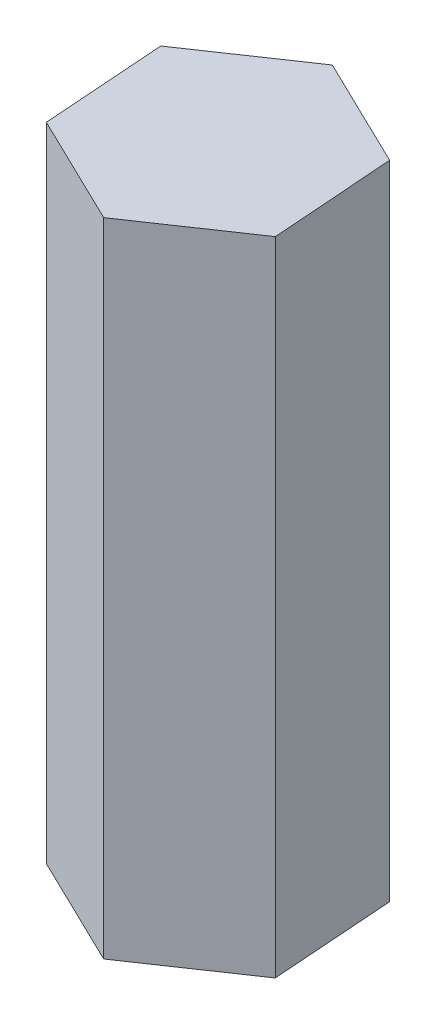
ISO-10303-21;
HEADER;
FILE_DESCRIPTION(('STEP AP214'),'2;1');
FILE_NAME('part.step','',(''),(''),'','','');
FILE_SCHEMA(('AUTOMOTIVE_DESIGN { 1 0 10303 214 1 1 1 1 }'));
ENDSEC;
DATA;
#1=APPLICATION_CONTEXT('core data for automotive mechanical design processes');
#2=APPLICATION_PROTOCOL_DEFINITION('international standard','automotive_design',2000,#1);
#3=PRODUCT_CONTEXT('',#1,'mechanical');
#4=PRODUCT('Part','Part','',(#3));
#5=PRODUCT_RELATED_PRODUCT_CATEGORY('part','',(#4));
#6=PRODUCT_DEFINITION_FORMATION('','',#4);
#7=PRODUCT_DEFINITION_CONTEXT('part definition',#1,'design');
#8=PRODUCT_DEFINITION('design','',#6,#7);
#9=PRODUCT_DEFINITION_SHAPE('','',#8);
#10=(LENGTH_UNIT() NAMED_UNIT(*) SI_UNIT(.MILLI.,.METRE.));
#11=(NAMED_UNIT(*) PLANE_ANGLE_UNIT() SI_UNIT($,.RADIAN.));
#12=(NAMED_UNIT(*) SI_UNIT($,.STERADIAN.) SOLID_ANGLE_UNIT());
#13=UNCERTAINTY_MEASURE_WITH_UNIT(LENGTH_MEASURE(1.E-05),#10,'distance_accuracy_value','');
#14=(GEOMETRIC_REPRESENTATION_CONTEXT(3) GLOBAL_UNCERTAINTY_ASSIGNED_CONTEXT((#13)) GLOBAL_UNIT_ASSIGNED_CONTEXT((#10,
#11,#12)) REPRESENTATION_CONTEXT('',''));
#15=CARTESIAN_POINT('',(0.,0.,0.));
#16=DIRECTION('',(0.,0.,1.));
#17=DIRECTION('',(1.,0.,0.));
#18=AXIS2_PLACEMENT_3D('',#15,#16,#17);
#19=CARTESIAN_POINT('',(0.209190014620343,15.,2.87916183482563));
#20=DIRECTION('',(-0.561442462499225,0.,-0.827515777071837));
#21=DIRECTION('',(-0.827515777071837,0.,0.561442462499225));
#22=AXIS2_PLACEMENT_3D('',#19,#20,#21);
#23=PLANE('',#22);
#24=DIRECTION('',(0.827515777071837,0.,-0.561442462499225));
#25=VECTOR('',#24,1.);
#26=CARTESIAN_POINT('',(0.209190014620343,0.,2.87916183482563));
#27=LINE('',#26,#25);
#28=CARTESIAN_POINT('',(0.209190014620343,0.,2.87916183482563));
#29=VERTEX_POINT('',#28);
#30=CARTESIAN_POINT('',(2.59802229787578,0.,1.25841705053356));
#31=VERTEX_POINT('',#30);
#32=EDGE_CURVE('E122',#29,#31,#27,.T.);
#33=ORIENTED_EDGE('',*,*,#32,.T.);
#34=DIRECTION('',(0.,-1.,0.));
#35=VECTOR('',#34,1.);
#36=CARTESIAN_POINT('',(2.59802229787578,15.,1.25841705053356));
#37=LINE('',#36,#35);
#38=CARTESIAN_POINT('',(2.59802229787578,15.,1.25841705053356));
#39=VERTEX_POINT('',#38);
#40=EDGE_CURVE('E11',#39,#31,#37,.T.);
#41=ORIENTED_EDGE('',*,*,#40,.F.);
#42=DIRECTION('',(0.827515777071837,0.,-0.561442462499225));
#43=VECTOR('',#42,1.);
#44=CARTESIAN_POINT('',(0.209190014620343,15.,2.87916183482563));
#45=LINE('',#44,#43);
#46=CARTESIAN_POINT('',(0.209190014620343,15.,2.87916183482563));
#47=VERTEX_POINT('',#46);
#48=EDGE_CURVE('E132',#47,#39,#45,.T.);
#49=ORIENTED_EDGE('',*,*,#48,.F.);
#50=DIRECTION('',(0.,-1.,0.));
#51=VECTOR('',#50,1.);
#52=CARTESIAN_POINT('',(0.209190014620343,15.,2.87916183482563));
#53=LINE('',#52,#51);
#54=EDGE_CURVE('E118',#47,#29,#53,.T.);
#55=ORIENTED_EDGE('',*,*,#54,.T.);
#56=EDGE_LOOP('',(#33,#41,#49,#55));
#57=FACE_BOUND('',#56,.T.);
#58=ADVANCED_FACE('F38',(#57),#23,.F.);
#59=CARTESIAN_POINT('',(2.59802229787578,15.,1.25841705053356));
#60=DIRECTION('',(-0.997370916226244,0.,0.0724655467517022));
#61=DIRECTION('',(0.0724655467517022,0.,0.997370916226244));
#62=AXIS2_PLACEMENT_3D('',#59,#60,#61);
#63=PLANE('',#62);
#64=DIRECTION('',(-0.0724655467517022,0.,-0.997370916226244));
#65=VECTOR('',#64,1.);
#66=CARTESIAN_POINT('',(2.59802229787578,0.,1.25841705053356));
#67=LINE('',#66,#65);
#68=CARTESIAN_POINT('',(2.38883228325544,0.,-1.62074478429207));
#69=VERTEX_POINT('',#68);
#70=EDGE_CURVE('E125',#31,#69,#67,.T.);
#71=ORIENTED_EDGE('',*,*,#70,.T.);
#72=DIRECTION('',(0.,-1.,0.));
#73=VECTOR('',#72,1.);
#74=CARTESIAN_POINT('',(2.38883228325544,15.,-1.62074478429207));
#75=LINE('',#74,#73);
#76=CARTESIAN_POINT('',(2.38883228325544,15.,-1.62074478429207));
#77=VERTEX_POINT('',#76);
#78=EDGE_CURVE('E46',#77,#69,#75,.T.);
#79=ORIENTED_EDGE('',*,*,#78,.F.);
#80=DIRECTION('',(-0.0724655467517022,0.,-0.997370916226244));
#81=VECTOR('',#80,1.);
#82=CARTESIAN_POINT('',(2.59802229787578,15.,1.25841705053356));
#83=LINE('',#82,#81);
#84=EDGE_CURVE('E91',#39,#77,#83,.T.);
#85=ORIENTED_EDGE('',*,*,#84,.F.);
#86=ORIENTED_EDGE('',*,*,#40,.T.);
#87=EDGE_LOOP('',(#71,#79,#85,#86));
#88=FACE_BOUND('',#87,.T.);
#89=ADVANCED_FACE('F156',(#88),#63,.F.);
#90=CARTESIAN_POINT('',(2.38883228325544,15.,-1.62074478429207));
#91=DIRECTION('',(-0.435928453727019,0.,0.899981323823539));
#92=DIRECTION('',(0.89998132382354,0.,0.435928453727019));
#93=AXIS2_PLACEMENT_3D('',#90,#91,#92);
#94=PLANE('',#93);
#95=DIRECTION('',(-0.899981323823539,0.,-0.435928453727019));
#96=VECTOR('',#95,1.);
#97=CARTESIAN_POINT('',(2.38883228325544,0.,-1.62074478429207));
#98=LINE('',#97,#96);
#99=CARTESIAN_POINT('',(-0.209190014620344,0.,-2.87916183482563));
#100=VERTEX_POINT('',#99);
#101=EDGE_CURVE('E127',#69,#100,#98,.T.);
#102=ORIENTED_EDGE('',*,*,#101,.T.);
#103=DIRECTION('',(0.,-1.,0.));
#104=VECTOR('',#103,1.);
#105=CARTESIAN_POINT('',(-0.209190014620344,15.,-2.87916183482563));
#106=LINE('',#105,#104);
#107=CARTESIAN_POINT('',(-0.209190014620344,15.,-2.87916183482563));
#108=VERTEX_POINT('',#107);
#109=EDGE_CURVE('E113',#108,#100,#106,.T.);
#110=ORIENTED_EDGE('',*,*,#109,.F.);
#111=DIRECTION('',(-0.899981323823539,0.,-0.435928453727019));
#112=VECTOR('',#111,1.);
#113=CARTESIAN_POINT('',(2.38883228325544,15.,-1.62074478429207));
#114=LINE('',#113,#112);
#115=EDGE_CURVE('E104',#77,#108,#114,.T.);
#116=ORIENTED_EDGE('',*,*,#115,.F.);
#117=ORIENTED_EDGE('',*,*,#78,.T.);
#118=EDGE_LOOP('',(#102,#110,#116,#117));
#119=FACE_BOUND('',#118,.T.);
#120=ADVANCED_FACE('F138',(#119),#94,.F.);
#121=CARTESIAN_POINT('',(-0.209190014620344,15.,-2.87916183482563));
#122=DIRECTION('',(0.561442462499225,0.,0.827515777071837));
#123=DIRECTION('',(0.827515777071837,0.,-0.561442462499225));
#124=AXIS2_PLACEMENT_3D('',#121,#122,#123);
#125=PLANE('',#124);
#126=DIRECTION('',(-0.827515777071837,0.,0.561442462499225));
#127=VECTOR('',#126,1.);
#128=CARTESIAN_POINT('',(-0.209190014620344,0.,-2.87916183482563));
#129=LINE('',#128,#127);
#130=CARTESIAN_POINT('',(-2.59802229787578,0.,-1.25841705053356));
#131=VERTEX_POINT('',#130);
#132=EDGE_CURVE('E112',#100,#131,#129,.T.);
#133=ORIENTED_EDGE('',*,*,#132,.T.);
#134=DIRECTION('',(0.,-1.,0.));
#135=VECTOR('',#134,1.);
#136=CARTESIAN_POINT('',(-2.59802229787578,15.,-1.25841705053356));
#137=LINE('',#136,#135);
#138=CARTESIAN_POINT('',(-2.59802229787578,15.,-1.25841705053356));
#139=VERTEX_POINT('',#138);
#140=EDGE_CURVE('E109',#139,#131,#137,.T.);
#141=ORIENTED_EDGE('',*,*,#140,.F.);
#142=DIRECTION('',(-0.827515777071837,0.,0.561442462499225));
#143=VECTOR('',#142,1.);
#144=CARTESIAN_POINT('',(-0.209190014620344,15.,-2.87916183482563));
#145=LINE('',#144,#143);
#146=EDGE_CURVE('E98',#108,#139,#145,.T.);
#147=ORIENTED_EDGE('',*,*,#146,.F.);
#148=ORIENTED_EDGE('',*,*,#109,.T.);
#149=EDGE_LOOP('',(#133,#141,#147,#148));
#150=FACE_BOUND('',#149,.T.);
#151=ADVANCED_FACE('F110',(#150),#125,.F.);
#152=CARTESIAN_POINT('',(-2.59802229787578,15.,-1.25841705053356));
#153=DIRECTION('',(0.997370916226244,0.,-0.0724655467517022));
#154=DIRECTION('',(-0.0724655467517022,0.,-0.997370916226244));
#155=AXIS2_PLACEMENT_3D('',#152,#153,#154);
#156=PLANE('',#155);
#157=DIRECTION('',(0.0724655467517022,0.,0.997370916226244));
#158=VECTOR('',#157,1.);
#159=CARTESIAN_POINT('',(-2.59802229787578,0.,-1.25841705053356));
#160=LINE('',#159,#158);
#161=CARTESIAN_POINT('',(-2.38883228325544,0.,1.62074478429207));
#162=VERTEX_POINT('',#161);
#163=EDGE_CURVE('E77',#131,#162,#160,.T.);
#164=ORIENTED_EDGE('',*,*,#163,.T.);
#165=DIRECTION('',(0.,-1.,0.));
#166=VECTOR('',#165,1.);
#167=CARTESIAN_POINT('',(-2.38883228325544,15.,1.62074478429207));
#168=LINE('',#167,#166);
#169=CARTESIAN_POINT('',(-2.38883228325544,15.,1.62074478429207));
#170=VERTEX_POINT('',#169);
#171=EDGE_CURVE('E114',#170,#162,#168,.T.);
#172=ORIENTED_EDGE('',*,*,#171,.F.);
#173=DIRECTION('',(0.0724655467517022,0.,0.997370916226244));
#174=VECTOR('',#173,1.);
#175=CARTESIAN_POINT('',(-2.59802229787578,15.,-1.25841705053356));
#176=LINE('',#175,#174);
#177=EDGE_CURVE('E102',#139,#170,#176,.T.);
#178=ORIENTED_EDGE('',*,*,#177,.F.);
#179=ORIENTED_EDGE('',*,*,#140,.T.);
#180=EDGE_LOOP('',(#164,#172,#178,#179));
#181=FACE_BOUND('',#180,.T.);
#182=ADVANCED_FACE('F116',(#181),#156,.F.);
#183=CARTESIAN_POINT('',(-2.38883228325544,15.,1.62074478429207));
#184=DIRECTION('',(0.435928453727019,0.,-0.899981323823539));
#185=DIRECTION('',(-0.899981323823539,0.,-0.435928453727019));
#186=AXIS2_PLACEMENT_3D('',#183,#184,#185);
#187=PLANE('',#186);
#188=DIRECTION('',(0.899981323823539,0.,0.435928453727019));
#189=VECTOR('',#188,1.);
#190=CARTESIAN_POINT('',(-2.38883228325544,0.,1.62074478429207));
#191=LINE('',#190,#189);
#192=EDGE_CURVE('E83',#162,#29,#191,.T.);
#193=ORIENTED_EDGE('',*,*,#192,.T.);
#194=ORIENTED_EDGE('',*,*,#54,.F.);
#195=DIRECTION('',(0.899981323823539,0.,0.435928453727019));
#196=VECTOR('',#195,1.);
#197=CARTESIAN_POINT('',(-2.38883228325544,15.,1.62074478429207));
#198=LINE('',#197,#196);
#199=EDGE_CURVE('E54',#170,#47,#198,.T.);
#200=ORIENTED_EDGE('',*,*,#199,.F.);
#201=ORIENTED_EDGE('',*,*,#171,.T.);
#202=EDGE_LOOP('',(#193,#194,#200,#201));
#203=FACE_BOUND('',#202,.T.);
#204=ADVANCED_FACE('F145',(#203),#187,.F.);
#205=CARTESIAN_POINT('',(0.,15.,0.));
#206=DIRECTION('',(0.,1.,0.));
#207=DIRECTION('',(0.,0.,1.));
#208=AXIS2_PLACEMENT_3D('',#205,#206,#207);
#209=PLANE('',#208);
#210=ORIENTED_EDGE('',*,*,#48,.T.);
#211=ORIENTED_EDGE('',*,*,#84,.T.);
#212=ORIENTED_EDGE('',*,*,#115,.T.);
#213=ORIENTED_EDGE('',*,*,#146,.T.);
#214=ORIENTED_EDGE('',*,*,#177,.T.);
#215=ORIENTED_EDGE('',*,*,#199,.T.);
#216=EDGE_LOOP('',(#210,#211,#212,#213,#214,#215));
#217=FACE_BOUND('',#216,.T.);
#218=ADVANCED_FACE('F100',(#217),#209,.T.);
#219=CARTESIAN_POINT('',(0.,0.,0.));
#220=DIRECTION('',(0.,1.,0.));
#221=DIRECTION('',(0.,0.,1.));
#222=AXIS2_PLACEMENT_3D('',#219,#220,#221);
#223=PLANE('',#222);
#224=ORIENTED_EDGE('',*,*,#32,.F.);
#225=ORIENTED_EDGE('',*,*,#192,.F.);
#226=ORIENTED_EDGE('',*,*,#163,.F.);
#227=ORIENTED_EDGE('',*,*,#132,.F.);
#228=ORIENTED_EDGE('',*,*,#101,.F.);
#229=ORIENTED_EDGE('',*,*,#70,.F.);
#230=EDGE_LOOP('',(#224,#225,#226,#227,#228,#229));
#231=FACE_BOUND('',#230,.T.);
#232=ADVANCED_FACE('F141',(#231),#223,.F.);
#233=CLOSED_SHELL('',(#58,#89,#120,#151,#182,#204,#218,#232));
#234=MANIFOLD_SOLID_BREP('B2',#233);
#235=ADVANCED_BREP_SHAPE_REPRESENTATION('',(#18,#234),#14);
#236=SHAPE_DEFINITION_REPRESENTATION(#9,#235);
ENDSEC;
END-ISO-10303-21;
